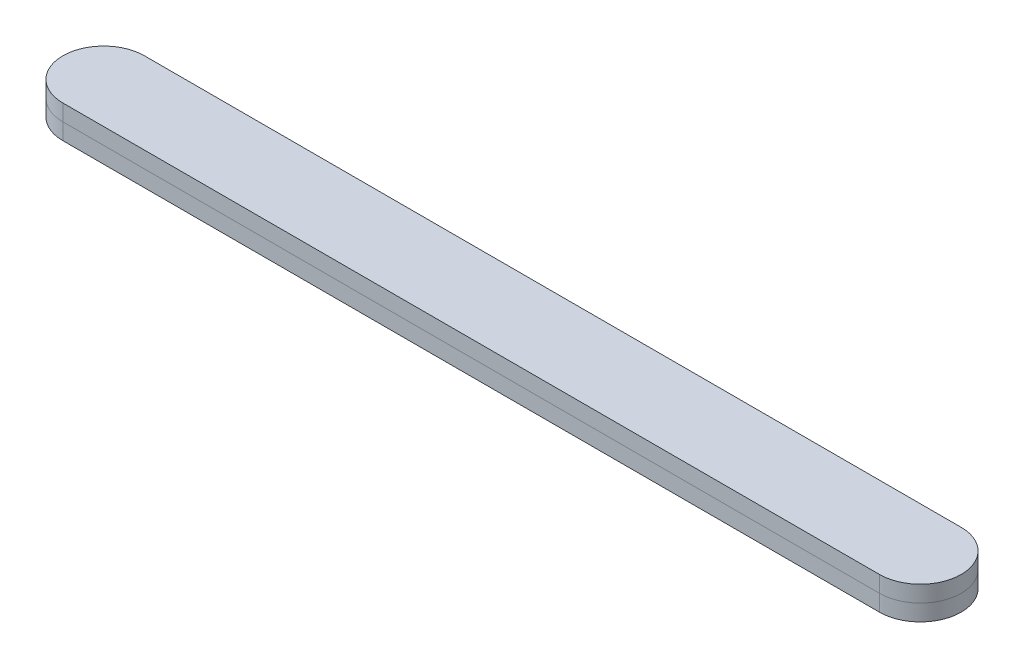
ISO-10303-21;
HEADER;
FILE_DESCRIPTION(('STEP AP214'),'2;1');
FILE_NAME('part.step','',(''),(''),'','','');
FILE_SCHEMA(('AUTOMOTIVE_DESIGN { 1 0 10303 214 1 1 1 1 }'));
ENDSEC;
DATA;
#1=APPLICATION_CONTEXT('core data for automotive mechanical design processes');
#2=APPLICATION_PROTOCOL_DEFINITION('international standard','automotive_design',2000,#1);
#3=PRODUCT_CONTEXT('',#1,'mechanical');
#4=PRODUCT('Part','Part','',(#3));
#5=PRODUCT_RELATED_PRODUCT_CATEGORY('part','',(#4));
#6=PRODUCT_DEFINITION_FORMATION('','',#4);
#7=PRODUCT_DEFINITION_CONTEXT('part definition',#1,'design');
#8=PRODUCT_DEFINITION('design','',#6,#7);
#9=PRODUCT_DEFINITION_SHAPE('','',#8);
#10=(LENGTH_UNIT() NAMED_UNIT(*) SI_UNIT(.MILLI.,.METRE.));
#11=(NAMED_UNIT(*) PLANE_ANGLE_UNIT() SI_UNIT($,.RADIAN.));
#12=(NAMED_UNIT(*) SI_UNIT($,.STERADIAN.) SOLID_ANGLE_UNIT());
#13=UNCERTAINTY_MEASURE_WITH_UNIT(LENGTH_MEASURE(1.E-05),#10,'distance_accuracy_value','');
#14=(GEOMETRIC_REPRESENTATION_CONTEXT(3) GLOBAL_UNCERTAINTY_ASSIGNED_CONTEXT((#13)) GLOBAL_UNIT_ASSIGNED_CONTEXT((#10,
#11,#12)) REPRESENTATION_CONTEXT('',''));
#15=CARTESIAN_POINT('',(0.,0.,0.));
#16=DIRECTION('',(0.,0.,1.));
#17=DIRECTION('',(1.,0.,0.));
#18=AXIS2_PLACEMENT_3D('',#15,#16,#17);
#19=CARTESIAN_POINT('',(974.572256388044,1018.45430126448,1018.9761164169));
#20=DIRECTION('',(0.,-1.,0.));
#21=DIRECTION('',(0.,0.,-1.));
#22=AXIS2_PLACEMENT_3D('',#19,#20,#21);
#23=CYLINDRICAL_SURFACE('',#22,5.);
#24=CARTESIAN_POINT('',(974.572256388044,1016.45430126448,1018.9761164169));
#25=DIRECTION('',(0.,1.,0.));
#26=DIRECTION('',(0.,0.,-1.));
#27=AXIS2_PLACEMENT_3D('',#24,#25,#26);
#28=CIRCLE('',#27,5.);
#29=CARTESIAN_POINT('',(974.572256388044,1016.45430126448,1013.9761164169));
#30=VERTEX_POINT('',#29);
#31=CARTESIAN_POINT('',(974.572256388044,1016.45430126448,1023.9761164169));
#32=VERTEX_POINT('',#31);
#33=EDGE_CURVE('P0_E86',#30,#32,#28,.T.);
#34=ORIENTED_EDGE('',*,*,#33,.T.);
#35=DIRECTION('',(0.,-1.,0.));
#36=VECTOR('',#35,1.);
#37=CARTESIAN_POINT('',(974.572256388044,1018.45430126448,1023.9761164169));
#38=LINE('',#37,#36);
#39=CARTESIAN_POINT('',(974.572256388044,1018.45430126448,1023.9761164169));
#40=VERTEX_POINT('',#39);
#41=EDGE_CURVE('P0_E11',#40,#32,#38,.T.);
#42=ORIENTED_EDGE('',*,*,#41,.F.);
#43=CARTESIAN_POINT('',(974.572256388044,1018.45430126448,1018.9761164169));
#44=DIRECTION('',(0.,1.,0.));
#45=DIRECTION('',(0.,0.,-1.));
#46=AXIS2_PLACEMENT_3D('',#43,#44,#45);
#47=CIRCLE('',#46,5.);
#48=CARTESIAN_POINT('',(974.572256388044,1018.45430126448,1013.9761164169));
#49=VERTEX_POINT('',#48);
#50=EDGE_CURVE('P0_E69',#49,#40,#47,.T.);
#51=ORIENTED_EDGE('',*,*,#50,.F.);
#52=DIRECTION('',(0.,-1.,0.));
#53=VECTOR('',#52,1.);
#54=CARTESIAN_POINT('',(974.572256388044,1018.45430126448,1013.9761164169));
#55=LINE('',#54,#53);
#56=EDGE_CURVE('P0_E82',#49,#30,#55,.T.);
#57=ORIENTED_EDGE('',*,*,#56,.T.);
#58=EDGE_LOOP('',(#34,#42,#51,#57));
#59=FACE_BOUND('',#58,.T.);
#60=ADVANCED_FACE('P0_F17',(#59),#23,.T.);
#61=CARTESIAN_POINT('',(974.572256388044,1018.45430126448,1023.9761164169));
#62=DIRECTION('',(0.,0.,-1.));
#63=DIRECTION('',(-1.,0.,0.));
#64=AXIS2_PLACEMENT_3D('',#61,#62,#63);
#65=PLANE('',#64);
#66=DIRECTION('',(1.,0.,0.));
#67=VECTOR('',#66,1.);
#68=CARTESIAN_POINT('',(974.572256388044,1016.45430126448,1023.9761164169));
#69=LINE('',#68,#67);
#70=CARTESIAN_POINT('',(1074.57225638804,1016.45430126448,1023.9761164169));
#71=VERTEX_POINT('',#70);
#72=EDGE_CURVE('P0_E74',#32,#71,#69,.T.);
#73=ORIENTED_EDGE('',*,*,#72,.T.);
#74=DIRECTION('',(0.,-1.,0.));
#75=VECTOR('',#74,1.);
#76=CARTESIAN_POINT('',(1074.57225638804,1018.45430126448,1023.9761164169));
#77=LINE('',#76,#75);
#78=CARTESIAN_POINT('',(1074.57225638804,1018.45430126448,1023.9761164169));
#79=VERTEX_POINT('',#78);
#80=EDGE_CURVE('P0_E26',#79,#71,#77,.T.);
#81=ORIENTED_EDGE('',*,*,#80,.F.);
#82=DIRECTION('',(1.,0.,0.));
#83=VECTOR('',#82,1.);
#84=CARTESIAN_POINT('',(974.572256388044,1018.45430126448,1023.9761164169));
#85=LINE('',#84,#83);
#86=EDGE_CURVE('P0_E64',#40,#79,#85,.T.);
#87=ORIENTED_EDGE('',*,*,#86,.F.);
#88=ORIENTED_EDGE('',*,*,#41,.T.);
#89=EDGE_LOOP('',(#73,#81,#87,#88));
#90=FACE_BOUND('',#89,.T.);
#91=ADVANCED_FACE('P0_F73',(#90),#65,.F.);
#92=CARTESIAN_POINT('',(1074.57225638804,1018.45430126448,1018.9761164169));
#93=DIRECTION('',(0.,-1.,0.));
#94=DIRECTION('',(0.,0.,-1.));
#95=AXIS2_PLACEMENT_3D('',#92,#93,#94);
#96=CYLINDRICAL_SURFACE('',#95,5.);
#97=CARTESIAN_POINT('',(1074.57225638804,1016.45430126448,1018.9761164169));
#98=DIRECTION('',(0.,1.,0.));
#99=DIRECTION('',(0.,0.,1.));
#100=AXIS2_PLACEMENT_3D('',#97,#98,#99);
#101=CIRCLE('',#100,5.);
#102=CARTESIAN_POINT('',(1074.57225638804,1016.45430126448,1013.9761164169));
#103=VERTEX_POINT('',#102);
#104=EDGE_CURVE('P0_E51',#71,#103,#101,.T.);
#105=ORIENTED_EDGE('',*,*,#104,.T.);
#106=DIRECTION('',(0.,-1.,0.));
#107=VECTOR('',#106,1.);
#108=CARTESIAN_POINT('',(1074.57225638804,1018.45430126448,1013.9761164169));
#109=LINE('',#108,#107);
#110=CARTESIAN_POINT('',(1074.57225638804,1018.45430126448,1013.9761164169));
#111=VERTEX_POINT('',#110);
#112=EDGE_CURVE('P0_E76',#111,#103,#109,.T.);
#113=ORIENTED_EDGE('',*,*,#112,.F.);
#114=CARTESIAN_POINT('',(1074.57225638804,1018.45430126448,1018.9761164169));
#115=DIRECTION('',(0.,1.,0.));
#116=DIRECTION('',(0.,0.,1.));
#117=AXIS2_PLACEMENT_3D('',#114,#115,#116);
#118=CIRCLE('',#117,5.);
#119=EDGE_CURVE('P0_E67',#79,#111,#118,.T.);
#120=ORIENTED_EDGE('',*,*,#119,.F.);
#121=ORIENTED_EDGE('',*,*,#80,.T.);
#122=EDGE_LOOP('',(#105,#113,#120,#121));
#123=FACE_BOUND('',#122,.T.);
#124=ADVANCED_FACE('P0_F77',(#123),#96,.T.);
#125=CARTESIAN_POINT('',(974.572256388044,1018.45430126448,1013.9761164169));
#126=DIRECTION('',(0.,0.,1.));
#127=DIRECTION('',(1.,0.,0.));
#128=AXIS2_PLACEMENT_3D('',#125,#126,#127);
#129=PLANE('',#128);
#130=DIRECTION('',(-1.,0.,0.));
#131=VECTOR('',#130,1.);
#132=CARTESIAN_POINT('',(974.572256388044,1016.45430126448,1013.9761164169));
#133=LINE('',#132,#131);
#134=EDGE_CURVE('P0_E57',#103,#30,#133,.T.);
#135=ORIENTED_EDGE('',*,*,#134,.T.);
#136=ORIENTED_EDGE('',*,*,#56,.F.);
#137=DIRECTION('',(-1.,0.,0.));
#138=VECTOR('',#137,1.);
#139=CARTESIAN_POINT('',(974.572256388044,1018.45430126448,1013.9761164169));
#140=LINE('',#139,#138);
#141=EDGE_CURVE('P0_E34',#111,#49,#140,.T.);
#142=ORIENTED_EDGE('',*,*,#141,.F.);
#143=ORIENTED_EDGE('',*,*,#112,.T.);
#144=EDGE_LOOP('',(#135,#136,#142,#143));
#145=FACE_BOUND('',#144,.T.);
#146=ADVANCED_FACE('P0_F99',(#145),#129,.F.);
#147=CARTESIAN_POINT('',(974.572256388044,1018.45430126448,1018.9761164169));
#148=DIRECTION('',(0.,-1.,0.));
#149=DIRECTION('',(0.,0.,-1.));
#150=AXIS2_PLACEMENT_3D('',#147,#148,#149);
#151=PLANE('',#150);
#152=ORIENTED_EDGE('',*,*,#50,.T.);
#153=ORIENTED_EDGE('',*,*,#86,.T.);
#154=ORIENTED_EDGE('',*,*,#119,.T.);
#155=ORIENTED_EDGE('',*,*,#141,.T.);
#156=EDGE_LOOP('',(#152,#153,#154,#155));
#157=FACE_BOUND('',#156,.T.);
#158=ADVANCED_FACE('P0_F65',(#157),#151,.F.);
#159=CARTESIAN_POINT('',(974.572256388044,1016.45430126448,1018.9761164169));
#160=DIRECTION('',(0.,-1.,0.));
#161=DIRECTION('',(0.,0.,-1.));
#162=AXIS2_PLACEMENT_3D('',#159,#160,#161);
#163=PLANE('',#162);
#164=ORIENTED_EDGE('',*,*,#33,.F.);
#165=ORIENTED_EDGE('',*,*,#134,.F.);
#166=ORIENTED_EDGE('',*,*,#104,.F.);
#167=ORIENTED_EDGE('',*,*,#72,.F.);
#168=EDGE_LOOP('',(#164,#165,#166,#167));
#169=FACE_BOUND('',#168,.T.);
#170=ADVANCED_FACE('P0_F102',(#169),#163,.T.);
#171=CLOSED_SHELL('',(#60,#91,#124,#146,#158,#170));
#172=MANIFOLD_SOLID_BREP('P0_B1',#171);
#173=CARTESIAN_POINT('',(974.572256388044,1020.45430126448,1018.9761164169));
#174=DIRECTION('',(0.,-1.,0.));
#175=DIRECTION('',(0.,0.,-1.));
#176=AXIS2_PLACEMENT_3D('',#173,#174,#175);
#177=CYLINDRICAL_SURFACE('',#176,5.);
#178=CARTESIAN_POINT('',(974.572256388044,1018.45430126448,1018.9761164169));
#179=DIRECTION('',(0.,1.,0.));
#180=DIRECTION('',(0.,0.,-1.));
#181=AXIS2_PLACEMENT_3D('',#178,#179,#180);
#182=CIRCLE('',#181,5.);
#183=CARTESIAN_POINT('',(974.572256388044,1018.45430126448,1013.9761164169));
#184=VERTEX_POINT('',#183);
#185=CARTESIAN_POINT('',(974.572256388044,1018.45430126448,1023.9761164169));
#186=VERTEX_POINT('',#185);
#187=EDGE_CURVE('P1_E79',#184,#186,#182,.T.);
#188=ORIENTED_EDGE('',*,*,#187,.T.);
#189=DIRECTION('',(0.,-1.,0.));
#190=VECTOR('',#189,1.);
#191=CARTESIAN_POINT('',(974.572256388044,1020.45430126448,1023.9761164169));
#192=LINE('',#191,#190);
#193=CARTESIAN_POINT('',(974.572256388044,1020.45430126448,1023.9761164169));
#194=VERTEX_POINT('',#193);
#195=EDGE_CURVE('P1_E10',#194,#186,#192,.T.);
#196=ORIENTED_EDGE('',*,*,#195,.F.);
#197=CARTESIAN_POINT('',(974.572256388044,1020.45430126448,1018.9761164169));
#198=DIRECTION('',(0.,1.,0.));
#199=DIRECTION('',(0.,0.,-1.));
#200=AXIS2_PLACEMENT_3D('',#197,#198,#199);
#201=CIRCLE('',#200,5.);
#202=CARTESIAN_POINT('',(974.572256388044,1020.45430126448,1013.9761164169));
#203=VERTEX_POINT('',#202);
#204=EDGE_CURVE('P1_E67',#203,#194,#201,.T.);
#205=ORIENTED_EDGE('',*,*,#204,.F.);
#206=DIRECTION('',(0.,-1.,0.));
#207=VECTOR('',#206,1.);
#208=CARTESIAN_POINT('',(974.572256388044,1020.45430126448,1013.9761164169));
#209=LINE('',#208,#207);
#210=EDGE_CURVE('P1_E75',#203,#184,#209,.T.);
#211=ORIENTED_EDGE('',*,*,#210,.T.);
#212=EDGE_LOOP('',(#188,#196,#205,#211));
#213=FACE_BOUND('',#212,.T.);
#214=ADVANCED_FACE('P1_F16',(#213),#177,.T.);
#215=CARTESIAN_POINT('',(974.572256388044,1020.45430126448,1023.9761164169));
#216=DIRECTION('',(0.,0.,-1.));
#217=DIRECTION('',(-1.,0.,0.));
#218=AXIS2_PLACEMENT_3D('',#215,#216,#217);
#219=PLANE('',#218);
#220=DIRECTION('',(1.,0.,0.));
#221=VECTOR('',#220,1.);
#222=CARTESIAN_POINT('',(974.572256388044,1018.45430126448,1023.9761164169));
#223=LINE('',#222,#221);
#224=CARTESIAN_POINT('',(1074.57225638804,1018.45430126448,1023.9761164169));
#225=VERTEX_POINT('',#224);
#226=EDGE_CURVE('P1_E71',#186,#225,#223,.T.);
#227=ORIENTED_EDGE('',*,*,#226,.T.);
#228=DIRECTION('',(0.,-1.,0.));
#229=VECTOR('',#228,1.);
#230=CARTESIAN_POINT('',(1074.57225638804,1020.45430126448,1023.9761164169));
#231=LINE('',#230,#229);
#232=CARTESIAN_POINT('',(1074.57225638804,1020.45430126448,1023.9761164169));
#233=VERTEX_POINT('',#232);
#234=EDGE_CURVE('P1_E24',#233,#225,#231,.T.);
#235=ORIENTED_EDGE('',*,*,#234,.F.);
#236=DIRECTION('',(1.,0.,0.));
#237=VECTOR('',#236,1.);
#238=CARTESIAN_POINT('',(974.572256388044,1020.45430126448,1023.9761164169));
#239=LINE('',#238,#237);
#240=EDGE_CURVE('P1_E62',#194,#233,#239,.T.);
#241=ORIENTED_EDGE('',*,*,#240,.F.);
#242=ORIENTED_EDGE('',*,*,#195,.T.);
#243=EDGE_LOOP('',(#227,#235,#241,#242));
#244=FACE_BOUND('',#243,.T.);
#245=ADVANCED_FACE('P1_F70',(#244),#219,.F.);
#246=CARTESIAN_POINT('',(1074.57225638804,1020.45430126448,1018.9761164169));
#247=DIRECTION('',(0.,-1.,0.));
#248=DIRECTION('',(0.,0.,-1.));
#249=AXIS2_PLACEMENT_3D('',#246,#247,#248);
#250=CYLINDRICAL_SURFACE('',#249,5.);
#251=CARTESIAN_POINT('',(1074.57225638804,1018.45430126448,1018.9761164169));
#252=DIRECTION('',(0.,1.,0.));
#253=DIRECTION('',(0.,0.,1.));
#254=AXIS2_PLACEMENT_3D('',#251,#252,#253);
#255=CIRCLE('',#254,5.);
#256=CARTESIAN_POINT('',(1074.57225638804,1018.45430126448,1013.9761164169));
#257=VERTEX_POINT('',#256);
#258=EDGE_CURVE('P1_E49',#225,#257,#255,.T.);
#259=ORIENTED_EDGE('',*,*,#258,.T.);
#260=DIRECTION('',(0.,-1.,0.));
#261=VECTOR('',#260,1.);
#262=CARTESIAN_POINT('',(1074.57225638804,1020.45430126448,1013.9761164169));
#263=LINE('',#262,#261);
#264=CARTESIAN_POINT('',(1074.57225638804,1020.45430126448,1013.9761164169));
#265=VERTEX_POINT('',#264);
#266=EDGE_CURVE('P1_E72',#265,#257,#263,.T.);
#267=ORIENTED_EDGE('',*,*,#266,.F.);
#268=CARTESIAN_POINT('',(1074.57225638804,1020.45430126448,1018.9761164169));
#269=DIRECTION('',(0.,1.,0.));
#270=DIRECTION('',(0.,0.,1.));
#271=AXIS2_PLACEMENT_3D('',#268,#269,#270);
#272=CIRCLE('',#271,5.);
#273=EDGE_CURVE('P1_E65',#233,#265,#272,.T.);
#274=ORIENTED_EDGE('',*,*,#273,.F.);
#275=ORIENTED_EDGE('',*,*,#234,.T.);
#276=EDGE_LOOP('',(#259,#267,#274,#275));
#277=FACE_BOUND('',#276,.T.);
#278=ADVANCED_FACE('P1_F73',(#277),#250,.T.);
#279=CARTESIAN_POINT('',(974.572256388044,1020.45430126448,1013.9761164169));
#280=DIRECTION('',(0.,0.,1.));
#281=DIRECTION('',(1.,0.,0.));
#282=AXIS2_PLACEMENT_3D('',#279,#280,#281);
#283=PLANE('',#282);
#284=DIRECTION('',(-1.,0.,0.));
#285=VECTOR('',#284,1.);
#286=CARTESIAN_POINT('',(974.572256388044,1018.45430126448,1013.9761164169));
#287=LINE('',#286,#285);
#288=EDGE_CURVE('P1_E55',#257,#184,#287,.T.);
#289=ORIENTED_EDGE('',*,*,#288,.T.);
#290=ORIENTED_EDGE('',*,*,#210,.F.);
#291=DIRECTION('',(-1.,0.,0.));
#292=VECTOR('',#291,1.);
#293=CARTESIAN_POINT('',(974.572256388044,1020.45430126448,1013.9761164169));
#294=LINE('',#293,#292);
#295=EDGE_CURVE('P1_E32',#265,#203,#294,.T.);
#296=ORIENTED_EDGE('',*,*,#295,.F.);
#297=ORIENTED_EDGE('',*,*,#266,.T.);
#298=EDGE_LOOP('',(#289,#290,#296,#297));
#299=FACE_BOUND('',#298,.T.);
#300=ADVANCED_FACE('P1_F86',(#299),#283,.F.);
#301=CARTESIAN_POINT('',(974.572256388044,1020.45430126448,1018.9761164169));
#302=DIRECTION('',(0.,-1.,0.));
#303=DIRECTION('',(0.,0.,-1.));
#304=AXIS2_PLACEMENT_3D('',#301,#302,#303);
#305=PLANE('',#304);
#306=ORIENTED_EDGE('',*,*,#204,.T.);
#307=ORIENTED_EDGE('',*,*,#240,.T.);
#308=ORIENTED_EDGE('',*,*,#273,.T.);
#309=ORIENTED_EDGE('',*,*,#295,.T.);
#310=EDGE_LOOP('',(#306,#307,#308,#309));
#311=FACE_BOUND('',#310,.T.);
#312=ADVANCED_FACE('P1_F63',(#311),#305,.F.);
#313=CARTESIAN_POINT('',(974.572256388044,1018.45430126448,1018.9761164169));
#314=DIRECTION('',(0.,-1.,0.));
#315=DIRECTION('',(0.,0.,-1.));
#316=AXIS2_PLACEMENT_3D('',#313,#314,#315);
#317=PLANE('',#316);
#318=ORIENTED_EDGE('',*,*,#187,.F.);
#319=ORIENTED_EDGE('',*,*,#288,.F.);
#320=ORIENTED_EDGE('',*,*,#258,.F.);
#321=ORIENTED_EDGE('',*,*,#226,.F.);
#322=EDGE_LOOP('',(#318,#319,#320,#321));
#323=FACE_BOUND('',#322,.T.);
#324=ADVANCED_FACE('P1_F89',(#323),#317,.T.);
#325=CLOSED_SHELL('',(#214,#245,#278,#300,#312,#324));
#326=MANIFOLD_SOLID_BREP('P1_B1',#325);
#327=ADVANCED_BREP_SHAPE_REPRESENTATION('',(#18,#172,#326),#14);
#328=SHAPE_DEFINITION_REPRESENTATION(#9,#327);
ENDSEC;
END-ISO-10303-21;
